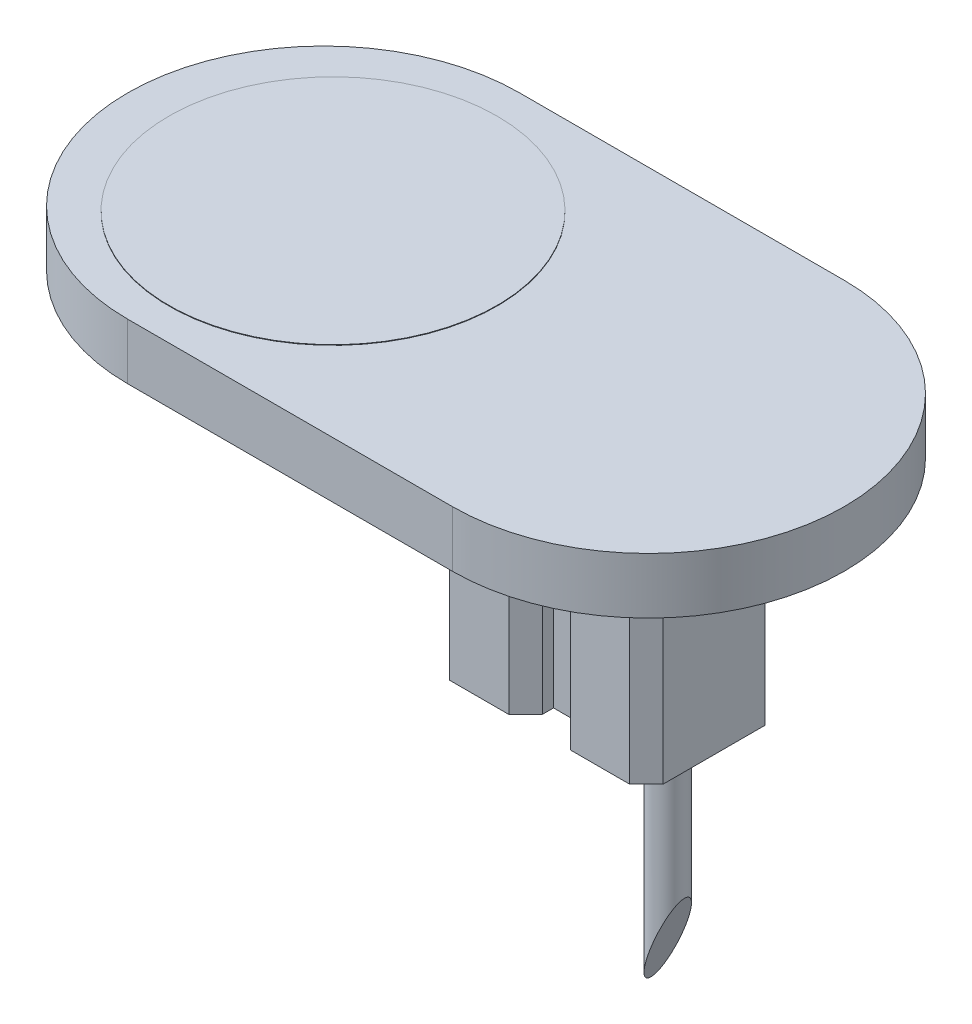
ISO-10303-21;
HEADER;
FILE_DESCRIPTION(('STEP AP214'),'2;1');
FILE_NAME('part.step','',(''),(''),'','','');
FILE_SCHEMA(('AUTOMOTIVE_DESIGN { 1 0 10303 214 1 1 1 1 }'));
ENDSEC;
DATA;
#1=APPLICATION_CONTEXT('core data for automotive mechanical design processes');
#2=APPLICATION_PROTOCOL_DEFINITION('international standard','automotive_design',2000,#1);
#3=PRODUCT_CONTEXT('',#1,'mechanical');
#4=PRODUCT('Part','Part','',(#3));
#5=PRODUCT_RELATED_PRODUCT_CATEGORY('part','',(#4));
#6=PRODUCT_DEFINITION_FORMATION('','',#4);
#7=PRODUCT_DEFINITION_CONTEXT('part definition',#1,'design');
#8=PRODUCT_DEFINITION('design','',#6,#7);
#9=PRODUCT_DEFINITION_SHAPE('','',#8);
#10=(LENGTH_UNIT() NAMED_UNIT(*) SI_UNIT(.MILLI.,.METRE.));
#11=(NAMED_UNIT(*) PLANE_ANGLE_UNIT() SI_UNIT($,.RADIAN.));
#12=(NAMED_UNIT(*) SI_UNIT($,.STERADIAN.) SOLID_ANGLE_UNIT());
#13=UNCERTAINTY_MEASURE_WITH_UNIT(LENGTH_MEASURE(1.E-05),#10,'distance_accuracy_value','');
#14=(GEOMETRIC_REPRESENTATION_CONTEXT(3) GLOBAL_UNCERTAINTY_ASSIGNED_CONTEXT((#13)) GLOBAL_UNIT_ASSIGNED_CONTEXT((#10,
#11,#12)) REPRESENTATION_CONTEXT('',''));
#15=CARTESIAN_POINT('',(0.,0.,0.));
#16=DIRECTION('',(0.,0.,1.));
#17=DIRECTION('',(1.,0.,0.));
#18=AXIS2_PLACEMENT_3D('',#15,#16,#17);
#19=CARTESIAN_POINT('',(-5.65837917886869,-4.,1.21074320255423));
#20=DIRECTION('',(0.,0.,-1.));
#21=DIRECTION('',(-1.,0.,0.));
#22=AXIS2_PLACEMENT_3D('',#19,#20,#21);
#23=PLANE('',#22);
#24=DIRECTION('',(-1.,0.,0.));
#25=VECTOR('',#24,1.);
#26=CARTESIAN_POINT('',(-5.65837917886869,-4.,1.21074320255423));
#27=LINE('',#26,#25);
#28=CARTESIAN_POINT('',(-2.14457884223965,-4.,1.21074320255423));
#29=VERTEX_POINT('',#28);
#30=CARTESIAN_POINT('',(-3.20147901055417,-4.,1.21074320255423));
#31=VERTEX_POINT('',#30);
#32=EDGE_CURVE('E268',#29,#31,#27,.T.);
#33=ORIENTED_EDGE('',*,*,#32,.F.);
#34=DIRECTION('',(0.,1.,0.));
#35=VECTOR('',#34,1.);
#36=CARTESIAN_POINT('',(-2.14457884223965,-4.,1.21074320255423));
#37=LINE('',#36,#35);
#38=CARTESIAN_POINT('',(-2.14457884223965,0.,1.21074320255423));
#39=VERTEX_POINT('',#38);
#40=EDGE_CURVE('E398',#29,#39,#37,.T.);
#41=ORIENTED_EDGE('',*,*,#40,.T.);
#42=DIRECTION('',(-1.,0.,0.));
#43=VECTOR('',#42,1.);
#44=CARTESIAN_POINT('',(-5.65837917886869,0.,1.21074320255423));
#45=LINE('',#44,#43);
#46=CARTESIAN_POINT('',(-3.20147901055417,0.,1.21074320255423));
#47=VERTEX_POINT('',#46);
#48=EDGE_CURVE('E258',#39,#47,#45,.T.);
#49=ORIENTED_EDGE('',*,*,#48,.T.);
#50=DIRECTION('',(0.,-1.,0.));
#51=VECTOR('',#50,1.);
#52=CARTESIAN_POINT('',(-3.20147901055417,-4.,1.21074320255423));
#53=LINE('',#52,#51);
#54=EDGE_CURVE('E395',#47,#31,#53,.T.);
#55=ORIENTED_EDGE('',*,*,#54,.T.);
#56=EDGE_LOOP('',(#33,#41,#49,#55));
#57=FACE_BOUND('',#56,.T.);
#58=ADVANCED_FACE('F40',(#57),#23,.F.);
#59=CARTESIAN_POINT('',(-5.65837917886869,-4.,-1.21074320255423));
#60=DIRECTION('',(0.,0.,1.));
#61=DIRECTION('',(1.,0.,0.));
#62=AXIS2_PLACEMENT_3D('',#59,#60,#61);
#63=PLANE('',#62);
#64=DIRECTION('',(1.,0.,0.));
#65=VECTOR('',#64,1.);
#66=CARTESIAN_POINT('',(-5.65837917886869,-4.,-1.21074320255423));
#67=LINE('',#66,#65);
#68=CARTESIAN_POINT('',(-5.35837917886869,-4.,-1.21074320255423));
#69=VERTEX_POINT('',#68);
#70=CARTESIAN_POINT('',(-4.30147901055417,-4.,-1.21074320255423));
#71=VERTEX_POINT('',#70);
#72=EDGE_CURVE('E259',#69,#71,#67,.T.);
#73=ORIENTED_EDGE('',*,*,#72,.F.);
#74=DIRECTION('',(0.,1.,0.));
#75=VECTOR('',#74,1.);
#76=CARTESIAN_POINT('',(-5.35837917886869,-4.,-1.21074320255423));
#77=LINE('',#76,#75);
#78=CARTESIAN_POINT('',(-5.35837917886869,0.,-1.21074320255423));
#79=VERTEX_POINT('',#78);
#80=EDGE_CURVE('E378',#69,#79,#77,.T.);
#81=ORIENTED_EDGE('',*,*,#80,.T.);
#82=DIRECTION('',(1.,0.,0.));
#83=VECTOR('',#82,1.);
#84=CARTESIAN_POINT('',(-5.65837917886869,0.,-1.21074320255423));
#85=LINE('',#84,#83);
#86=CARTESIAN_POINT('',(-4.30147901055417,0.,-1.21074320255423));
#87=VERTEX_POINT('',#86);
#88=EDGE_CURVE('E277',#79,#87,#85,.T.);
#89=ORIENTED_EDGE('',*,*,#88,.T.);
#90=DIRECTION('',(0.,-1.,0.));
#91=VECTOR('',#90,1.);
#92=CARTESIAN_POINT('',(-4.30147901055417,-4.,-1.21074320255423));
#93=LINE('',#92,#91);
#94=EDGE_CURVE('E375',#87,#71,#93,.T.);
#95=ORIENTED_EDGE('',*,*,#94,.T.);
#96=EDGE_LOOP('',(#73,#81,#89,#95));
#97=FACE_BOUND('',#96,.T.);
#98=ADVANCED_FACE('F480',(#97),#63,.F.);
#99=CARTESIAN_POINT('',(-8.8188622754491,0.,0.));
#100=DIRECTION('',(0.,1.,0.));
#101=DIRECTION('',(0.,0.,1.));
#102=AXIS2_PLACEMENT_3D('',#99,#100,#101);
#103=PLANE('',#102);
#104=CARTESIAN_POINT('',(-8.8188622754491,0.,0.));
#105=DIRECTION('',(0.,1.,0.));
#106=DIRECTION('',(0.,0.,1.));
#107=AXIS2_PLACEMENT_3D('',#104,#105,#106);
#108=CIRCLE('',#107,3.5);
#109=CARTESIAN_POINT('',(-8.8188622754491,0.,-3.5));
#110=VERTEX_POINT('',#109);
#111=CARTESIAN_POINT('',(-8.8188622754491,0.,3.5));
#112=VERTEX_POINT('',#111);
#113=EDGE_CURVE('E292',#110,#112,#108,.T.);
#114=ORIENTED_EDGE('',*,*,#113,.F.);
#115=DIRECTION('',(-1.,0.,0.));
#116=VECTOR('',#115,1.);
#117=CARTESIAN_POINT('',(-8.8188622754491,0.,-3.5));
#118=LINE('',#117,#116);
#119=CARTESIAN_POINT('',(-3.0188622754491,0.,-3.5));
#120=VERTEX_POINT('',#119);
#121=EDGE_CURVE('E304',#120,#110,#118,.T.);
#122=ORIENTED_EDGE('',*,*,#121,.F.);
#123=CARTESIAN_POINT('',(-3.0188622754491,0.,0.));
#124=DIRECTION('',(0.,1.,0.));
#125=DIRECTION('',(0.,0.,1.));
#126=AXIS2_PLACEMENT_3D('',#123,#124,#125);
#127=CIRCLE('',#126,3.5);
#128=CARTESIAN_POINT('',(-3.0188622754491,0.,3.5));
#129=VERTEX_POINT('',#128);
#130=EDGE_CURVE('E320',#129,#120,#127,.T.);
#131=ORIENTED_EDGE('',*,*,#130,.F.);
#132=DIRECTION('',(1.,0.,0.));
#133=VECTOR('',#132,1.);
#134=CARTESIAN_POINT('',(-8.8188622754491,0.,3.5));
#135=LINE('',#134,#133);
#136=EDGE_CURVE('E317',#112,#129,#135,.T.);
#137=ORIENTED_EDGE('',*,*,#136,.F.);
#138=EDGE_LOOP('',(#114,#122,#131,#137));
#139=FACE_BOUND('',#138,.T.);
#140=DIRECTION('',(0.,0.,-1.));
#141=VECTOR('',#140,1.);
#142=CARTESIAN_POINT('',(-5.65837917886869,0.,1.21074320255423));
#143=LINE('',#142,#141);
#144=CARTESIAN_POINT('',(-5.65837917886869,0.,0.91074320255423));
#145=VERTEX_POINT('',#144);
#146=CARTESIAN_POINT('',(-5.65837917886869,0.,-0.91074320255423));
#147=VERTEX_POINT('',#146);
#148=EDGE_CURVE('E252',#145,#147,#143,.T.);
#149=ORIENTED_EDGE('',*,*,#148,.F.);
#150=DIRECTION('',(-0.70710678118655,0.,-0.707106781186545));
#151=VECTOR('',#150,1.);
#152=CARTESIAN_POINT('',(-7.69399232843602,0.,-1.12486994701309));
#153=LINE('',#152,#151);
#154=CARTESIAN_POINT('',(-5.35837917886869,0.,1.21074320255423));
#155=VERTEX_POINT('',#154);
#156=EDGE_CURVE('E414',#145,#155,#153,.F.);
#157=ORIENTED_EDGE('',*,*,#156,.T.);
#158=CARTESIAN_POINT('',(-4.30147901055417,0.,1.21074320255423));
#159=VERTEX_POINT('',#158);
#160=EDGE_CURVE('E285',#159,#155,#45,.T.);
#161=ORIENTED_EDGE('',*,*,#160,.F.);
#162=DIRECTION('',(-0.70710678118655,0.,0.707106781186545));
#163=VECTOR('',#162,1.);
#164=CARTESIAN_POINT('',(-5.95479904172453,0.,2.86406323372458));
#165=LINE('',#164,#163);
#166=CARTESIAN_POINT('',(-4.00147901055417,0.,0.91074320255423));
#167=VERTEX_POINT('',#166);
#168=EDGE_CURVE('E65',#159,#167,#165,.F.);
#169=ORIENTED_EDGE('',*,*,#168,.T.);
#170=DIRECTION('',(0.,0.,1.));
#171=VECTOR('',#170,1.);
#172=CARTESIAN_POINT('',(-4.00147901055417,0.,0.710743202554228));
#173=LINE('',#172,#171);
#174=CARTESIAN_POINT('',(-4.00147901055417,0.,0.710743202554228));
#175=VERTEX_POINT('',#174);
#176=EDGE_CURVE('E201',#175,#167,#173,.T.);
#177=ORIENTED_EDGE('',*,*,#176,.F.);
#178=DIRECTION('',(-1.,0.,0.));
#179=VECTOR('',#178,1.);
#180=CARTESIAN_POINT('',(-3.50147901055417,0.,0.710743202554228));
#181=LINE('',#180,#179);
#182=CARTESIAN_POINT('',(-3.50147901055417,0.,0.710743202554228));
#183=VERTEX_POINT('',#182);
#184=EDGE_CURVE('E205',#183,#175,#181,.T.);
#185=ORIENTED_EDGE('',*,*,#184,.F.);
#186=DIRECTION('',(0.,0.,1.));
#187=VECTOR('',#186,1.);
#188=CARTESIAN_POINT('',(-3.50147901055417,0.,0.710743202554228));
#189=LINE('',#188,#187);
#190=CARTESIAN_POINT('',(-3.50147901055417,0.,0.91074320255423));
#191=VERTEX_POINT('',#190);
#192=EDGE_CURVE('E192',#183,#191,#189,.T.);
#193=ORIENTED_EDGE('',*,*,#192,.T.);
#194=DIRECTION('',(-0.70710678118655,0.,-0.707106781186545));
#195=VECTOR('',#194,1.);
#196=CARTESIAN_POINT('',(-6.61554224427876,0.,-2.20332003117035));
#197=LINE('',#196,#195);
#198=EDGE_CURVE('E45',#191,#47,#197,.F.);
#199=ORIENTED_EDGE('',*,*,#198,.T.);
#200=ORIENTED_EDGE('',*,*,#48,.F.);
#201=DIRECTION('',(-0.707106781186546,0.,0.70710678118655));
#202=VECTOR('',#201,1.);
#203=CARTESIAN_POINT('',(-4.87634895756724,0.,3.94251331788183));
#204=LINE('',#203,#202);
#205=CARTESIAN_POINT('',(-1.84457884223965,0.,0.910743202554226));
#206=VERTEX_POINT('',#205);
#207=EDGE_CURVE('E417',#39,#206,#204,.F.);
#208=ORIENTED_EDGE('',*,*,#207,.T.);
#209=DIRECTION('',(0.,0.,1.));
#210=VECTOR('',#209,1.);
#211=CARTESIAN_POINT('',(-1.84457884223965,0.,1.21074320255423));
#212=LINE('',#211,#210);
#213=CARTESIAN_POINT('',(-1.84457884223965,0.,-0.91074320255423));
#214=VERTEX_POINT('',#213);
#215=EDGE_CURVE('E281',#214,#206,#212,.T.);
#216=ORIENTED_EDGE('',*,*,#215,.F.);
#217=DIRECTION('',(0.70710678118655,0.,0.707106781186545));
#218=VECTOR('',#217,1.);
#219=CARTESIAN_POINT('',(-4.87634895756728,0.,-3.94251331788184));
#220=LINE('',#219,#218);
#221=CARTESIAN_POINT('',(-2.14457884223965,0.,-1.21074320255423));
#222=VERTEX_POINT('',#221);
#223=EDGE_CURVE('E408',#214,#222,#220,.F.);
#224=ORIENTED_EDGE('',*,*,#223,.T.);
#225=CARTESIAN_POINT('',(-3.20147901055417,0.,-1.21074320255423));
#226=VERTEX_POINT('',#225);
#227=EDGE_CURVE('E276',#226,#222,#85,.T.);
#228=ORIENTED_EDGE('',*,*,#227,.F.);
#229=DIRECTION('',(0.707106781186548,0.,-0.707106781186548));
#230=VECTOR('',#229,1.);
#231=CARTESIAN_POINT('',(-6.61554224427875,0.,2.20332003117035));
#232=LINE('',#231,#230);
#233=CARTESIAN_POINT('',(-3.50147901055417,0.,-0.910743202554228));
#234=VERTEX_POINT('',#233);
#235=EDGE_CURVE('E423',#226,#234,#232,.F.);
#236=ORIENTED_EDGE('',*,*,#235,.T.);
#237=DIRECTION('',(1.,0.,0.));
#238=VECTOR('',#237,1.);
#239=CARTESIAN_POINT('',(-4.00147901055417,0.,-0.910743202554228));
#240=LINE('',#239,#238);
#241=CARTESIAN_POINT('',(-4.00147901055417,0.,-0.910743202554228));
#242=VERTEX_POINT('',#241);
#243=EDGE_CURVE('E240',#242,#234,#240,.T.);
#244=ORIENTED_EDGE('',*,*,#243,.F.);
#245=DIRECTION('',(0.707106781186548,0.,0.707106781186548));
#246=VECTOR('',#245,1.);
#247=CARTESIAN_POINT('',(-5.95479904172452,0.,-2.86406323372458));
#248=LINE('',#247,#246);
#249=EDGE_CURVE('E420',#242,#87,#248,.F.);
#250=ORIENTED_EDGE('',*,*,#249,.T.);
#251=ORIENTED_EDGE('',*,*,#88,.F.);
#252=DIRECTION('',(0.707106781186548,0.,-0.707106781186548));
#253=VECTOR('',#252,1.);
#254=CARTESIAN_POINT('',(-7.69399232843601,0.,1.12486994701309));
#255=LINE('',#254,#253);
#256=EDGE_CURVE('E411',#79,#147,#255,.F.);
#257=ORIENTED_EDGE('',*,*,#256,.T.);
#258=EDGE_LOOP('',(#149,#157,#161,#169,#177,#185,#193,#199,#200,#208,#216,#224,#228,#236,#244,
#250,#251,#257));
#259=FACE_BOUND('',#258,.T.);
#260=ADVANCED_FACE('F207',(#139,#259),#103,.F.);
#261=CARTESIAN_POINT('',(-8.8188622754491,1.,0.));
#262=DIRECTION('',(0.,-1.,0.));
#263=DIRECTION('',(0.,0.,-1.));
#264=AXIS2_PLACEMENT_3D('',#261,#262,#263);
#265=CYLINDRICAL_SURFACE('',#264,3.5);
#266=ORIENTED_EDGE('',*,*,#113,.T.);
#267=DIRECTION('',(0.,-1.,0.));
#268=VECTOR('',#267,1.);
#269=CARTESIAN_POINT('',(-8.8188622754491,1.,3.5));
#270=LINE('',#269,#268);
#271=CARTESIAN_POINT('',(-8.8188622754491,1.,3.5));
#272=VERTEX_POINT('',#271);
#273=EDGE_CURVE('E298',#272,#112,#270,.T.);
#274=ORIENTED_EDGE('',*,*,#273,.F.);
#275=CARTESIAN_POINT('',(-8.8188622754491,1.,0.));
#276=DIRECTION('',(0.,1.,0.));
#277=DIRECTION('',(0.,0.,1.));
#278=AXIS2_PLACEMENT_3D('',#275,#276,#277);
#279=CIRCLE('',#278,3.5);
#280=CARTESIAN_POINT('',(-8.8188622754491,1.,-3.5));
#281=VERTEX_POINT('',#280);
#282=EDGE_CURVE('E299',#281,#272,#279,.T.);
#283=ORIENTED_EDGE('',*,*,#282,.F.);
#284=DIRECTION('',(0.,-1.,0.));
#285=VECTOR('',#284,1.);
#286=CARTESIAN_POINT('',(-8.8188622754491,1.,-3.5));
#287=LINE('',#286,#285);
#288=EDGE_CURVE('E313',#281,#110,#287,.T.);
#289=ORIENTED_EDGE('',*,*,#288,.T.);
#290=EDGE_LOOP('',(#266,#274,#283,#289));
#291=FACE_BOUND('',#290,.T.);
#292=ADVANCED_FACE('F647',(#291),#265,.T.);
#293=CARTESIAN_POINT('',(-8.8188622754491,1.,3.5));
#294=DIRECTION('',(0.,0.,-1.));
#295=DIRECTION('',(-1.,0.,0.));
#296=AXIS2_PLACEMENT_3D('',#293,#294,#295);
#297=PLANE('',#296);
#298=ORIENTED_EDGE('',*,*,#136,.T.);
#299=DIRECTION('',(0.,-1.,0.));
#300=VECTOR('',#299,1.);
#301=CARTESIAN_POINT('',(-3.0188622754491,1.,3.5));
#302=LINE('',#301,#300);
#303=CARTESIAN_POINT('',(-3.0188622754491,1.,3.5));
#304=VERTEX_POINT('',#303);
#305=EDGE_CURVE('E332',#304,#129,#302,.T.);
#306=ORIENTED_EDGE('',*,*,#305,.F.);
#307=DIRECTION('',(1.,0.,0.));
#308=VECTOR('',#307,1.);
#309=CARTESIAN_POINT('',(-8.8188622754491,1.,3.5));
#310=LINE('',#309,#308);
#311=EDGE_CURVE('E303',#272,#304,#310,.T.);
#312=ORIENTED_EDGE('',*,*,#311,.F.);
#313=ORIENTED_EDGE('',*,*,#273,.T.);
#314=EDGE_LOOP('',(#298,#306,#312,#313));
#315=FACE_BOUND('',#314,.T.);
#316=ADVANCED_FACE('F713',(#315),#297,.F.);
#317=CARTESIAN_POINT('',(-3.0188622754491,1.,0.));
#318=DIRECTION('',(0.,-1.,0.));
#319=DIRECTION('',(0.,0.,-1.));
#320=AXIS2_PLACEMENT_3D('',#317,#318,#319);
#321=CYLINDRICAL_SURFACE('',#320,3.5);
#322=ORIENTED_EDGE('',*,*,#130,.T.);
#323=DIRECTION('',(0.,-1.,0.));
#324=VECTOR('',#323,1.);
#325=CARTESIAN_POINT('',(-3.0188622754491,1.,-3.5));
#326=LINE('',#325,#324);
#327=CARTESIAN_POINT('',(-3.0188622754491,1.,-3.5));
#328=VERTEX_POINT('',#327);
#329=EDGE_CURVE('E328',#328,#120,#326,.T.);
#330=ORIENTED_EDGE('',*,*,#329,.F.);
#331=CARTESIAN_POINT('',(-3.0188622754491,1.,0.));
#332=DIRECTION('',(0.,1.,0.));
#333=DIRECTION('',(0.,0.,1.));
#334=AXIS2_PLACEMENT_3D('',#331,#332,#333);
#335=CIRCLE('',#334,3.5);
#336=EDGE_CURVE('E307',#304,#328,#335,.T.);
#337=ORIENTED_EDGE('',*,*,#336,.F.);
#338=ORIENTED_EDGE('',*,*,#305,.T.);
#339=EDGE_LOOP('',(#322,#330,#337,#338));
#340=FACE_BOUND('',#339,.T.);
#341=ADVANCED_FACE('F703',(#340),#321,.T.);
#342=CARTESIAN_POINT('',(-8.8188622754491,1.,-3.5));
#343=DIRECTION('',(0.,0.,1.));
#344=DIRECTION('',(1.,0.,0.));
#345=AXIS2_PLACEMENT_3D('',#342,#343,#344);
#346=PLANE('',#345);
#347=ORIENTED_EDGE('',*,*,#121,.T.);
#348=ORIENTED_EDGE('',*,*,#288,.F.);
#349=DIRECTION('',(-1.,0.,0.));
#350=VECTOR('',#349,1.);
#351=CARTESIAN_POINT('',(-8.8188622754491,1.,-3.5));
#352=LINE('',#351,#350);
#353=EDGE_CURVE('E310',#328,#281,#352,.T.);
#354=ORIENTED_EDGE('',*,*,#353,.F.);
#355=ORIENTED_EDGE('',*,*,#329,.T.);
#356=EDGE_LOOP('',(#347,#348,#354,#355));
#357=FACE_BOUND('',#356,.T.);
#358=ADVANCED_FACE('F693',(#357),#346,.F.);
#359=CARTESIAN_POINT('',(-8.8188622754491,1.,0.));
#360=DIRECTION('',(0.,1.,0.));
#361=DIRECTION('',(0.,0.,1.));
#362=AXIS2_PLACEMENT_3D('',#359,#360,#361);
#363=PLANE('',#362);
#364=CARTESIAN_POINT('',(-8.65149971674797,1.,0.));
#365=DIRECTION('',(0.,1.,0.));
#366=DIRECTION('',(0.,0.,1.));
#367=AXIS2_PLACEMENT_3D('',#364,#365,#366);
#368=CIRCLE('',#367,2.93045394720376);
#369=CARTESIAN_POINT('',(-8.65149971674797,1.,-2.93045394720376));
#370=VERTEX_POINT('',#369);
#371=EDGE_CURVE('E293',#370,#370,#368,.T.);
#372=ORIENTED_EDGE('',*,*,#371,.F.);
#373=EDGE_LOOP('',(#372));
#374=FACE_BOUND('',#373,.T.);
#375=ORIENTED_EDGE('',*,*,#282,.T.);
#376=ORIENTED_EDGE('',*,*,#311,.T.);
#377=ORIENTED_EDGE('',*,*,#336,.T.);
#378=ORIENTED_EDGE('',*,*,#353,.T.);
#379=EDGE_LOOP('',(#375,#376,#377,#378));
#380=FACE_BOUND('',#379,.T.);
#381=ADVANCED_FACE('F683',(#374,#380),#363,.T.);
#382=CARTESIAN_POINT('',(-8.65149971674797,1.01,0.));
#383=DIRECTION('',(0.,-1.,0.));
#384=DIRECTION('',(0.,0.,-1.));
#385=AXIS2_PLACEMENT_3D('',#382,#383,#384);
#386=CYLINDRICAL_SURFACE('',#385,2.93045394720376);
#387=CARTESIAN_POINT('',(-8.65149971674797,1.01,0.));
#388=DIRECTION('',(0.,1.,0.));
#389=DIRECTION('',(0.,0.,1.));
#390=AXIS2_PLACEMENT_3D('',#387,#388,#389);
#391=CIRCLE('',#390,2.93045394720376);
#392=CARTESIAN_POINT('',(-8.65149971674797,1.01,-2.93045394720376));
#393=VERTEX_POINT('',#392);
#394=EDGE_CURVE('E272',#393,#393,#391,.T.);
#395=CARTESIAN_POINT('',(-8.65149971674797,1.01,-2.93045394720376));
#396=CARTESIAN_POINT('',(-8.65149971674797,1.00989583333333,-2.93045394720376));
#397=CARTESIAN_POINT('',(-8.65149971674797,1.00979166666667,-2.93045394720376));
#398=CARTESIAN_POINT('',(-8.65149971674797,1.00958333333333,-2.93045394720376));
#399=CARTESIAN_POINT('',(-8.65149971674797,1.00947916666667,-2.93045394720376));
#400=CARTESIAN_POINT('',(-8.65149971674797,1.00927083333333,-2.93045394720376));
#401=CARTESIAN_POINT('',(-8.65149971674797,1.00916666666667,-2.93045394720376));
#402=CARTESIAN_POINT('',(-8.65149971674797,1.00895833333333,-2.93045394720376));
#403=CARTESIAN_POINT('',(-8.65149971674797,1.00885416666667,-2.93045394720376));
#404=CARTESIAN_POINT('',(-8.65149971674797,1.00864583333333,-2.93045394720376));
#405=CARTESIAN_POINT('',(-8.65149971674797,1.00854166666667,-2.93045394720376));
#406=CARTESIAN_POINT('',(-8.65149971674797,1.00833333333333,-2.93045394720376));
#407=CARTESIAN_POINT('',(-8.65149971674797,1.00822916666667,-2.93045394720376));
#408=CARTESIAN_POINT('',(-8.65149971674797,1.00802083333333,-2.93045394720376));
#409=CARTESIAN_POINT('',(-8.65149971674797,1.00791666666667,-2.93045394720376));
#410=CARTESIAN_POINT('',(-8.65149971674797,1.00770833333333,-2.93045394720376));
#411=CARTESIAN_POINT('',(-8.65149971674797,1.00760416666667,-2.93045394720376));
#412=CARTESIAN_POINT('',(-8.65149971674797,1.00739583333333,-2.93045394720376));
#413=CARTESIAN_POINT('',(-8.65149971674797,1.00729166666667,-2.93045394720376));
#414=CARTESIAN_POINT('',(-8.65149971674797,1.00708333333333,-2.93045394720376));
#415=CARTESIAN_POINT('',(-8.65149971674797,1.00697916666667,-2.93045394720376));
#416=CARTESIAN_POINT('',(-8.65149971674797,1.00677083333333,-2.93045394720376));
#417=CARTESIAN_POINT('',(-8.65149971674797,1.00666666666667,-2.93045394720376));
#418=CARTESIAN_POINT('',(-8.65149971674797,1.00645833333333,-2.93045394720376));
#419=CARTESIAN_POINT('',(-8.65149971674797,1.00635416666667,-2.93045394720376));
#420=CARTESIAN_POINT('',(-8.65149971674797,1.00614583333333,-2.93045394720376));
#421=CARTESIAN_POINT('',(-8.65149971674797,1.00604166666667,-2.93045394720376));
#422=CARTESIAN_POINT('',(-8.65149971674797,1.00583333333333,-2.93045394720376));
#423=CARTESIAN_POINT('',(-8.65149971674797,1.00572916666667,-2.93045394720376));
#424=CARTESIAN_POINT('',(-8.65149971674797,1.00552083333333,-2.93045394720376));
#425=CARTESIAN_POINT('',(-8.65149971674797,1.00541666666667,-2.93045394720376));
#426=CARTESIAN_POINT('',(-8.65149971674797,1.00520833333333,-2.93045394720376));
#427=CARTESIAN_POINT('',(-8.65149971674797,1.00510416666667,-2.93045394720376));
#428=CARTESIAN_POINT('',(-8.65149971674797,1.00489583333333,-2.93045394720376));
#429=CARTESIAN_POINT('',(-8.65149971674797,1.00479166666667,-2.93045394720376));
#430=CARTESIAN_POINT('',(-8.65149971674797,1.00458333333333,-2.93045394720376));
#431=CARTESIAN_POINT('',(-8.65149971674797,1.00447916666667,-2.93045394720376));
#432=CARTESIAN_POINT('',(-8.65149971674797,1.00427083333333,-2.93045394720376));
#433=CARTESIAN_POINT('',(-8.65149971674797,1.00416666666667,-2.93045394720376));
#434=CARTESIAN_POINT('',(-8.65149971674797,1.00395833333333,-2.93045394720376));
#435=CARTESIAN_POINT('',(-8.65149971674797,1.00385416666667,-2.93045394720376));
#436=CARTESIAN_POINT('',(-8.65149971674797,1.00364583333333,-2.93045394720376));
#437=CARTESIAN_POINT('',(-8.65149971674797,1.00354166666667,-2.93045394720376));
#438=CARTESIAN_POINT('',(-8.65149971674797,1.00333333333333,-2.93045394720376));
#439=CARTESIAN_POINT('',(-8.65149971674797,1.00322916666667,-2.93045394720376));
#440=CARTESIAN_POINT('',(-8.65149971674797,1.00302083333333,-2.93045394720376));
#441=CARTESIAN_POINT('',(-8.65149971674797,1.00291666666667,-2.93045394720376));
#442=CARTESIAN_POINT('',(-8.65149971674797,1.00270833333333,-2.93045394720376));
#443=CARTESIAN_POINT('',(-8.65149971674797,1.00260416666667,-2.93045394720376));
#444=CARTESIAN_POINT('',(-8.65149971674797,1.00239583333333,-2.93045394720376));
#445=CARTESIAN_POINT('',(-8.65149971674797,1.00229166666667,-2.93045394720376));
#446=CARTESIAN_POINT('',(-8.65149971674797,1.00208333333333,-2.93045394720376));
#447=CARTESIAN_POINT('',(-8.65149971674797,1.00197916666667,-2.93045394720376));
#448=CARTESIAN_POINT('',(-8.65149971674797,1.00177083333333,-2.93045394720376));
#449=CARTESIAN_POINT('',(-8.65149971674797,1.00166666666667,-2.93045394720376));
#450=CARTESIAN_POINT('',(-8.65149971674797,1.00145833333333,-2.93045394720376));
#451=CARTESIAN_POINT('',(-8.65149971674797,1.00135416666667,-2.93045394720376));
#452=CARTESIAN_POINT('',(-8.65149971674797,1.00114583333333,-2.93045394720376));
#453=CARTESIAN_POINT('',(-8.65149971674797,1.00104166666667,-2.93045394720376));
#454=CARTESIAN_POINT('',(-8.65149971674797,1.00083333333333,-2.93045394720376));
#455=CARTESIAN_POINT('',(-8.65149971674797,1.00072916666667,-2.93045394720376));
#456=CARTESIAN_POINT('',(-8.65149971674797,1.00052083333333,-2.93045394720376));
#457=CARTESIAN_POINT('',(-8.65149971674797,1.00041666666667,-2.93045394720376));
#458=CARTESIAN_POINT('',(-8.65149971674797,1.00020833333333,-2.93045394720376));
#459=CARTESIAN_POINT('',(-8.65149971674797,1.00010416666667,-2.93045394720376));
#460=CARTESIAN_POINT('',(-8.65149971674797,1.,-2.93045394720376));
#461=B_SPLINE_CURVE_WITH_KNOTS('',3,(#395,#396,#397,#398,#399,#400,#401,#402,#403,#404,#405,
#406,#407,#408,#409,#410,#411,#412,#413,#414,#415,#416,#417,#418,#419,#420,#421,#422,#423,#424,
#425,#426,#427,#428,#429,#430,#431,#432,#433,#434,#435,#436,#437,#438,#439,#440,#441,#442,#443,
#444,#445,#446,#447,#448,#449,#450,#451,#452,#453,#454,#455,#456,#457,#458,#459,#460),
.UNSPECIFIED.,.F.,.F.,(4,2,2,2,2,2,2,2,2,2,2,2,2,2,2,2,2,2,2,2,2,2,2,2,2,2,2,2,2,2,2,2,4),(0.,
0.000312499999999879,0.000624999999999975,0.000937499999999853,0.00124999999999995,
0.00156249999999983,0.00187499999999992,0.0021874999999998,0.0024999999999999,
0.00281249999999999,0.00312499999999987,0.00343749999999997,0.00374999999999985,
0.00406249999999994,0.00437499999999982,0.00468749999999992,0.00500000000000001,
0.00531249999999989,0.00562499999999999,0.00593749999999987,0.00624999999999996,
0.00656249999999984,0.00687499999999994,0.00718749999999982,0.00749999999999991,
0.00781250000000001,0.00812499999999989,0.00843749999999998,0.00874999999999986,
0.00906249999999996,0.00937499999999983,0.00968749999999993,0.01),.UNSPECIFIED.);
#462=EDGE_CURVE('BSEAM672',#393,#370,#461,.T.);
#463=ORIENTED_EDGE('',*,*,#394,.F.);
#464=ORIENTED_EDGE('',*,*,#371,.T.);
#465=ORIENTED_EDGE('',*,*,#462,.T.);
#466=ORIENTED_EDGE('',*,*,#462,.F.);
#467=EDGE_LOOP('',(#463,#465,#464,#466));
#468=FACE_BOUND('',#467,.T.);
#469=ADVANCED_FACE('F672',(#468),#386,.T.);
#470=CARTESIAN_POINT('',(-8.65149971674797,1.01,0.));
#471=DIRECTION('',(0.,1.,0.));
#472=DIRECTION('',(0.,0.,1.));
#473=AXIS2_PLACEMENT_3D('',#470,#471,#472);
#474=PLANE('',#473);
#475=ORIENTED_EDGE('',*,*,#394,.T.);
#476=EDGE_LOOP('',(#475));
#477=FACE_BOUND('',#476,.T.);
#478=ADVANCED_FACE('F668',(#477),#474,.T.);
#479=CARTESIAN_POINT('',(-5.65837917886869,-4.,1.21074320255423));
#480=DIRECTION('',(1.,0.,0.));
#481=DIRECTION('',(0.,0.,-1.));
#482=AXIS2_PLACEMENT_3D('',#479,#480,#481);
#483=PLANE('',#482);
#484=ORIENTED_EDGE('',*,*,#148,.T.);
#485=DIRECTION('',(0.,-1.,0.));
#486=VECTOR('',#485,1.);
#487=CARTESIAN_POINT('',(-5.65837917886869,-4.,-0.91074320255423));
#488=LINE('',#487,#486);
#489=CARTESIAN_POINT('',(-5.65837917886869,-4.,-0.91074320255423));
#490=VERTEX_POINT('',#489);
#491=EDGE_CURVE('E386',#147,#490,#488,.T.);
#492=ORIENTED_EDGE('',*,*,#491,.T.);
#493=DIRECTION('',(0.,0.,-1.));
#494=VECTOR('',#493,1.);
#495=CARTESIAN_POINT('',(-5.65837917886869,-4.,1.21074320255423));
#496=LINE('',#495,#494);
#497=CARTESIAN_POINT('',(-5.65837917886869,-4.,0.91074320255423));
#498=VERTEX_POINT('',#497);
#499=EDGE_CURVE('E253',#498,#490,#496,.T.);
#500=ORIENTED_EDGE('',*,*,#499,.F.);
#501=DIRECTION('',(0.,1.,0.));
#502=VECTOR('',#501,1.);
#503=CARTESIAN_POINT('',(-5.65837917886869,-4.,0.91074320255423));
#504=LINE('',#503,#502);
#505=EDGE_CURVE('E382',#498,#145,#504,.T.);
#506=ORIENTED_EDGE('',*,*,#505,.T.);
#507=EDGE_LOOP('',(#484,#492,#500,#506));
#508=FACE_BOUND('',#507,.T.);
#509=ADVANCED_FACE('F471',(#508),#483,.F.);
#510=ORIENTED_EDGE('',*,*,#227,.T.);
#511=DIRECTION('',(0.,-1.,0.));
#512=VECTOR('',#511,1.);
#513=CARTESIAN_POINT('',(-2.14457884223965,-4.,-1.21074320255423));
#514=LINE('',#513,#512);
#515=CARTESIAN_POINT('',(-2.14457884223965,-4.,-1.21074320255423));
#516=VERTEX_POINT('',#515);
#517=EDGE_CURVE('E348',#222,#516,#514,.T.);
#518=ORIENTED_EDGE('',*,*,#517,.T.);
#519=CARTESIAN_POINT('',(-3.20147901055417,-4.,-1.21074320255423));
#520=VERTEX_POINT('',#519);
#521=EDGE_CURVE('E257',#520,#516,#67,.T.);
#522=ORIENTED_EDGE('',*,*,#521,.F.);
#523=DIRECTION('',(0.,1.,0.));
#524=VECTOR('',#523,1.);
#525=CARTESIAN_POINT('',(-3.20147901055417,-4.,-1.21074320255423));
#526=LINE('',#525,#524);
#527=EDGE_CURVE('E345',#520,#226,#526,.T.);
#528=ORIENTED_EDGE('',*,*,#527,.T.);
#529=EDGE_LOOP('',(#510,#518,#522,#528));
#530=FACE_BOUND('',#529,.T.);
#531=ADVANCED_FACE('F452',(#530),#63,.F.);
#532=CARTESIAN_POINT('',(-1.84457884223965,-4.,1.21074320255423));
#533=DIRECTION('',(-1.,0.,0.));
#534=DIRECTION('',(0.,0.,1.));
#535=AXIS2_PLACEMENT_3D('',#532,#533,#534);
#536=PLANE('',#535);
#537=DIRECTION('',(0.,0.,1.));
#538=VECTOR('',#537,1.);
#539=CARTESIAN_POINT('',(-1.84457884223965,-4.,1.21074320255423));
#540=LINE('',#539,#538);
#541=CARTESIAN_POINT('',(-1.84457884223965,-4.,-0.91074320255423));
#542=VERTEX_POINT('',#541);
#543=CARTESIAN_POINT('',(-1.84457884223965,-4.,0.910743202554226));
#544=VERTEX_POINT('',#543);
#545=EDGE_CURVE('E263',#542,#544,#540,.T.);
#546=ORIENTED_EDGE('',*,*,#545,.F.);
#547=DIRECTION('',(0.,1.,0.));
#548=VECTOR('',#547,1.);
#549=CARTESIAN_POINT('',(-1.84457884223965,-4.,-0.91074320255423));
#550=LINE('',#549,#548);
#551=EDGE_CURVE('E341',#542,#214,#550,.T.);
#552=ORIENTED_EDGE('',*,*,#551,.T.);
#553=ORIENTED_EDGE('',*,*,#215,.T.);
#554=DIRECTION('',(0.,-1.,0.));
#555=VECTOR('',#554,1.);
#556=CARTESIAN_POINT('',(-1.84457884223965,-4.,0.910743202554226));
#557=LINE('',#556,#555);
#558=EDGE_CURVE('E297',#206,#544,#557,.T.);
#559=ORIENTED_EDGE('',*,*,#558,.T.);
#560=EDGE_LOOP('',(#546,#552,#553,#559));
#561=FACE_BOUND('',#560,.T.);
#562=ADVANCED_FACE('F442',(#561),#536,.F.);
#563=ORIENTED_EDGE('',*,*,#160,.T.);
#564=DIRECTION('',(0.,-1.,0.));
#565=VECTOR('',#564,1.);
#566=CARTESIAN_POINT('',(-5.35837917886869,-4.,1.21074320255423));
#567=LINE('',#566,#565);
#568=CARTESIAN_POINT('',(-5.35837917886869,-4.,1.21074320255423));
#569=VERTEX_POINT('',#568);
#570=EDGE_CURVE('E392',#155,#569,#567,.T.);
#571=ORIENTED_EDGE('',*,*,#570,.T.);
#572=CARTESIAN_POINT('',(-4.30147901055417,-4.,1.21074320255423));
#573=VERTEX_POINT('',#572);
#574=EDGE_CURVE('E267',#573,#569,#27,.T.);
#575=ORIENTED_EDGE('',*,*,#574,.F.);
#576=DIRECTION('',(0.,1.,0.));
#577=VECTOR('',#576,1.);
#578=CARTESIAN_POINT('',(-4.30147901055417,-4.,1.21074320255423));
#579=LINE('',#578,#577);
#580=EDGE_CURVE('E389',#573,#159,#579,.T.);
#581=ORIENTED_EDGE('',*,*,#580,.T.);
#582=EDGE_LOOP('',(#563,#571,#575,#581));
#583=FACE_BOUND('',#582,.T.);
#584=ADVANCED_FACE('F505',(#583),#23,.F.);
#585=CARTESIAN_POINT('',(0.,-4.,0.));
#586=DIRECTION('',(0.,-1.,0.));
#587=DIRECTION('',(0.,0.,-1.));
#588=AXIS2_PLACEMENT_3D('',#585,#586,#587);
#589=PLANE('',#588);
#590=CARTESIAN_POINT('',(-2.67302892639691,-4.,0.));
#591=DIRECTION('',(0.,-1.,0.));
#592=DIRECTION('',(0.,0.,-1.));
#593=AXIS2_PLACEMENT_3D('',#590,#591,#592);
#594=CIRCLE('',#593,0.3);
#595=CARTESIAN_POINT('',(-2.67302892639691,-4.,-0.3));
#596=VERTEX_POINT('',#595);
#597=EDGE_CURVE('E11',#596,#596,#594,.T.);
#598=ORIENTED_EDGE('',*,*,#597,.F.);
#599=EDGE_LOOP('',(#598));
#600=FACE_BOUND('',#599,.T.);
#601=ORIENTED_EDGE('',*,*,#521,.T.);
#602=DIRECTION('',(-0.70710678118655,0.,-0.707106781186545));
#603=VECTOR('',#602,1.);
#604=CARTESIAN_POINT('',(-0.466917819842706,-4.,0.466917819842709));
#605=LINE('',#604,#603);
#606=EDGE_CURVE('E372',#516,#542,#605,.F.);
#607=ORIENTED_EDGE('',*,*,#606,.T.);
#608=ORIENTED_EDGE('',*,*,#545,.T.);
#609=DIRECTION('',(0.707106781186546,0.,-0.70710678118655));
#610=VECTOR('',#609,1.);
#611=CARTESIAN_POINT('',(-0.466917819842719,-4.,-0.466917819842716));
#612=LINE('',#611,#610);
#613=EDGE_CURVE('E363',#544,#29,#612,.F.);
#614=ORIENTED_EDGE('',*,*,#613,.T.);
#615=ORIENTED_EDGE('',*,*,#32,.T.);
#616=DIRECTION('',(0.70710678118655,0.,0.707106781186545));
#617=VECTOR('',#616,1.);
#618=CARTESIAN_POINT('',(-2.20611110655419,-4.,2.2061111065542));
#619=LINE('',#618,#617);
#620=CARTESIAN_POINT('',(-3.50147901055417,-4.,0.91074320255423));
#621=VERTEX_POINT('',#620);
#622=EDGE_CURVE('E351',#31,#621,#619,.F.);
#623=ORIENTED_EDGE('',*,*,#622,.T.);
#624=DIRECTION('',(0.,0.,1.));
#625=VECTOR('',#624,1.);
#626=CARTESIAN_POINT('',(-3.50147901055417,-4.,0.710743202554228));
#627=LINE('',#626,#625);
#628=CARTESIAN_POINT('',(-3.50147901055417,-4.,0.710743202554228));
#629=VERTEX_POINT('',#628);
#630=EDGE_CURVE('E227',#629,#621,#627,.T.);
#631=ORIENTED_EDGE('',*,*,#630,.F.);
#632=DIRECTION('',(1.,0.,0.));
#633=VECTOR('',#632,1.);
#634=CARTESIAN_POINT('',(-3.50147901055417,-4.,0.710743202554228));
#635=LINE('',#634,#633);
#636=CARTESIAN_POINT('',(-4.00147901055417,-4.,0.710743202554228));
#637=VERTEX_POINT('',#636);
#638=EDGE_CURVE('E202',#637,#629,#635,.T.);
#639=ORIENTED_EDGE('',*,*,#638,.F.);
#640=DIRECTION('',(0.,0.,1.));
#641=VECTOR('',#640,1.);
#642=CARTESIAN_POINT('',(-4.00147901055417,-4.,0.710743202554228));
#643=LINE('',#642,#641);
#644=CARTESIAN_POINT('',(-4.00147901055417,-4.,0.91074320255423));
#645=VERTEX_POINT('',#644);
#646=EDGE_CURVE('E231',#637,#645,#643,.T.);
#647=ORIENTED_EDGE('',*,*,#646,.T.);
#648=DIRECTION('',(0.70710678118655,0.,-0.707106781186545));
#649=VECTOR('',#648,1.);
#650=CARTESIAN_POINT('',(-1.54536790399996,-4.,-1.54536790399997));
#651=LINE('',#650,#649);
#652=EDGE_CURVE('E354',#645,#573,#651,.F.);
#653=ORIENTED_EDGE('',*,*,#652,.T.);
#654=ORIENTED_EDGE('',*,*,#574,.T.);
#655=DIRECTION('',(0.70710678118655,0.,0.707106781186545));
#656=VECTOR('',#655,1.);
#657=CARTESIAN_POINT('',(-3.28456119071144,-4.,3.28456119071146));
#658=LINE('',#657,#656);
#659=EDGE_CURVE('E366',#569,#498,#658,.F.);
#660=ORIENTED_EDGE('',*,*,#659,.T.);
#661=ORIENTED_EDGE('',*,*,#499,.T.);
#662=DIRECTION('',(-0.707106781186548,0.,0.707106781186548));
#663=VECTOR('',#662,1.);
#664=CARTESIAN_POINT('',(-3.28456119071146,-4.,-3.28456119071146));
#665=LINE('',#664,#663);
#666=EDGE_CURVE('E369',#490,#69,#665,.F.);
#667=ORIENTED_EDGE('',*,*,#666,.T.);
#668=ORIENTED_EDGE('',*,*,#72,.T.);
#669=DIRECTION('',(-0.707106781186548,0.,-0.707106781186548));
#670=VECTOR('',#669,1.);
#671=CARTESIAN_POINT('',(-1.54536790399997,-4.,1.54536790399997));
#672=LINE('',#671,#670);
#673=CARTESIAN_POINT('',(-4.00147901055417,-4.,-0.910743202554228));
#674=VERTEX_POINT('',#673);
#675=EDGE_CURVE('E360',#71,#674,#672,.F.);
#676=ORIENTED_EDGE('',*,*,#675,.T.);
#677=DIRECTION('',(-1.,0.,0.));
#678=VECTOR('',#677,1.);
#679=CARTESIAN_POINT('',(-4.00147901055417,-4.,-0.910743202554228));
#680=LINE('',#679,#678);
#681=CARTESIAN_POINT('',(-3.50147901055417,-4.,-0.910743202554228));
#682=VERTEX_POINT('',#681);
#683=EDGE_CURVE('E248',#682,#674,#680,.T.);
#684=ORIENTED_EDGE('',*,*,#683,.F.);
#685=DIRECTION('',(-0.707106781186548,0.,0.707106781186548));
#686=VECTOR('',#685,1.);
#687=CARTESIAN_POINT('',(-2.2061111065542,-4.,-2.2061111065542));
#688=LINE('',#687,#686);
#689=EDGE_CURVE('E357',#682,#520,#688,.F.);
#690=ORIENTED_EDGE('',*,*,#689,.T.);
#691=EDGE_LOOP('',(#601,#607,#608,#614,#615,#623,#631,#639,#647,#653,#654,#660,#661,#667,#668,
#676,#684,#690));
#692=FACE_BOUND('',#691,.T.);
#693=ADVANCED_FACE('F434',(#600,#692),#589,.T.);
#694=CARTESIAN_POINT('',(0.,0.,-0.910743202554228));
#695=DIRECTION('',(0.,0.,-1.));
#696=DIRECTION('',(-1.,0.,0.));
#697=AXIS2_PLACEMENT_3D('',#694,#695,#696);
#698=PLANE('',#697);
#699=DIRECTION('',(0.,1.,0.));
#700=VECTOR('',#699,1.);
#701=CARTESIAN_POINT('',(-4.00147901055417,-4.,-0.910743202554228));
#702=LINE('',#701,#700);
#703=EDGE_CURVE('E230',#674,#242,#702,.T.);
#704=ORIENTED_EDGE('',*,*,#703,.T.);
#705=ORIENTED_EDGE('',*,*,#243,.T.);
#706=DIRECTION('',(0.,-1.,0.));
#707=VECTOR('',#706,1.);
#708=CARTESIAN_POINT('',(-3.50147901055417,-4.,-0.910743202554228));
#709=LINE('',#708,#707);
#710=EDGE_CURVE('E244',#234,#682,#709,.T.);
#711=ORIENTED_EDGE('',*,*,#710,.T.);
#712=ORIENTED_EDGE('',*,*,#683,.T.);
#713=EDGE_LOOP('',(#704,#705,#711,#712));
#714=FACE_BOUND('',#713,.T.);
#715=ADVANCED_FACE('F489',(#714),#698,.T.);
#716=CARTESIAN_POINT('',(-3.50147901055417,-4.,0.710743202554228));
#717=DIRECTION('',(1.,0.,0.));
#718=DIRECTION('',(0.,0.,-1.));
#719=AXIS2_PLACEMENT_3D('',#716,#717,#718);
#720=PLANE('',#719);
#721=ORIENTED_EDGE('',*,*,#630,.T.);
#722=DIRECTION('',(0.,1.,0.));
#723=VECTOR('',#722,1.);
#724=CARTESIAN_POINT('',(-3.50147901055417,-4.,0.91074320255423));
#725=LINE('',#724,#723);
#726=EDGE_CURVE('E199',#621,#191,#725,.T.);
#727=ORIENTED_EDGE('',*,*,#726,.T.);
#728=ORIENTED_EDGE('',*,*,#192,.F.);
#729=DIRECTION('',(0.,1.,0.));
#730=VECTOR('',#729,1.);
#731=CARTESIAN_POINT('',(-3.50147901055417,-4.,0.710743202554228));
#732=LINE('',#731,#730);
#733=EDGE_CURVE('E197',#629,#183,#732,.T.);
#734=ORIENTED_EDGE('',*,*,#733,.F.);
#735=EDGE_LOOP('',(#721,#727,#728,#734));
#736=FACE_BOUND('',#735,.T.);
#737=ADVANCED_FACE('F195',(#736),#720,.F.);
#738=CARTESIAN_POINT('',(-4.00147901055417,-4.,0.710743202554228));
#739=DIRECTION('',(-1.,0.,0.));
#740=DIRECTION('',(0.,0.,1.));
#741=AXIS2_PLACEMENT_3D('',#738,#739,#740);
#742=PLANE('',#741);
#743=ORIENTED_EDGE('',*,*,#176,.T.);
#744=DIRECTION('',(0.,-1.,0.));
#745=VECTOR('',#744,1.);
#746=CARTESIAN_POINT('',(-4.00147901055417,-4.,0.91074320255423));
#747=LINE('',#746,#745);
#748=EDGE_CURVE('E402',#167,#645,#747,.T.);
#749=ORIENTED_EDGE('',*,*,#748,.T.);
#750=ORIENTED_EDGE('',*,*,#646,.F.);
#751=DIRECTION('',(0.,-1.,0.));
#752=VECTOR('',#751,1.);
#753=CARTESIAN_POINT('',(-4.00147901055417,-4.,0.710743202554228));
#754=LINE('',#753,#752);
#755=EDGE_CURVE('E211',#175,#637,#754,.T.);
#756=ORIENTED_EDGE('',*,*,#755,.F.);
#757=EDGE_LOOP('',(#743,#749,#750,#756));
#758=FACE_BOUND('',#757,.T.);
#759=ADVANCED_FACE('F521',(#758),#742,.F.);
#760=CARTESIAN_POINT('',(0.,0.,0.710743202554228));
#761=DIRECTION('',(0.,0.,1.));
#762=DIRECTION('',(1.,0.,0.));
#763=AXIS2_PLACEMENT_3D('',#760,#761,#762);
#764=PLANE('',#763);
#765=ORIENTED_EDGE('',*,*,#733,.T.);
#766=ORIENTED_EDGE('',*,*,#184,.T.);
#767=ORIENTED_EDGE('',*,*,#755,.T.);
#768=ORIENTED_EDGE('',*,*,#638,.T.);
#769=EDGE_LOOP('',(#765,#766,#767,#768));
#770=FACE_BOUND('',#769,.T.);
#771=ADVANCED_FACE('F213',(#770),#764,.T.);
#772=CARTESIAN_POINT('',(-1.84457884223965,-4.,-0.91074320255423));
#773=DIRECTION('',(-0.707106781186545,0.,0.70710678118655));
#774=DIRECTION('',(0.,1.,0.));
#775=AXIS2_PLACEMENT_3D('',#772,#773,#774);
#776=PLANE('',#775);
#777=ORIENTED_EDGE('',*,*,#606,.F.);
#778=ORIENTED_EDGE('',*,*,#517,.F.);
#779=ORIENTED_EDGE('',*,*,#223,.F.);
#780=ORIENTED_EDGE('',*,*,#551,.F.);
#781=EDGE_LOOP('',(#777,#778,#779,#780));
#782=FACE_BOUND('',#781,.T.);
#783=ADVANCED_FACE('F446',(#782),#776,.F.);
#784=CARTESIAN_POINT('',(-5.35837917886869,-4.,-1.21074320255423));
#785=DIRECTION('',(0.707106781186547,0.,0.707106781186547));
#786=DIRECTION('',(0.,1.,0.));
#787=AXIS2_PLACEMENT_3D('',#784,#785,#786);
#788=PLANE('',#787);
#789=ORIENTED_EDGE('',*,*,#666,.F.);
#790=ORIENTED_EDGE('',*,*,#491,.F.);
#791=ORIENTED_EDGE('',*,*,#256,.F.);
#792=ORIENTED_EDGE('',*,*,#80,.F.);
#793=EDGE_LOOP('',(#789,#790,#791,#792));
#794=FACE_BOUND('',#793,.T.);
#795=ADVANCED_FACE('F477',(#794),#788,.F.);
#796=CARTESIAN_POINT('',(-5.65837917886869,-4.,0.91074320255423));
#797=DIRECTION('',(0.707106781186545,0.,-0.70710678118655));
#798=DIRECTION('',(0.,1.,0.));
#799=AXIS2_PLACEMENT_3D('',#796,#797,#798);
#800=PLANE('',#799);
#801=ORIENTED_EDGE('',*,*,#659,.F.);
#802=ORIENTED_EDGE('',*,*,#570,.F.);
#803=ORIENTED_EDGE('',*,*,#156,.F.);
#804=ORIENTED_EDGE('',*,*,#505,.F.);
#805=EDGE_LOOP('',(#801,#802,#803,#804));
#806=FACE_BOUND('',#805,.T.);
#807=ADVANCED_FACE('F469',(#806),#800,.F.);
#808=CARTESIAN_POINT('',(-2.14457884223965,-4.,1.21074320255423));
#809=DIRECTION('',(-0.70710678118655,0.,-0.707106781186546));
#810=DIRECTION('',(0.,1.,0.));
#811=AXIS2_PLACEMENT_3D('',#808,#809,#810);
#812=PLANE('',#811);
#813=ORIENTED_EDGE('',*,*,#613,.F.);
#814=ORIENTED_EDGE('',*,*,#558,.F.);
#815=ORIENTED_EDGE('',*,*,#207,.F.);
#816=ORIENTED_EDGE('',*,*,#40,.F.);
#817=EDGE_LOOP('',(#813,#814,#815,#816));
#818=FACE_BOUND('',#817,.T.);
#819=ADVANCED_FACE('F437',(#818),#812,.F.);
#820=CARTESIAN_POINT('',(-4.00147901055417,-4.,-0.910743202554228));
#821=DIRECTION('',(-0.707106781186547,0.,0.707106781186547));
#822=DIRECTION('',(0.,1.,0.));
#823=AXIS2_PLACEMENT_3D('',#820,#821,#822);
#824=PLANE('',#823);
#825=ORIENTED_EDGE('',*,*,#675,.F.);
#826=ORIENTED_EDGE('',*,*,#94,.F.);
#827=ORIENTED_EDGE('',*,*,#249,.F.);
#828=ORIENTED_EDGE('',*,*,#703,.F.);
#829=EDGE_LOOP('',(#825,#826,#827,#828));
#830=FACE_BOUND('',#829,.T.);
#831=ADVANCED_FACE('F486',(#830),#824,.F.);
#832=CARTESIAN_POINT('',(-3.50147901055417,-4.,-0.910743202554228));
#833=DIRECTION('',(0.707106781186547,0.,0.707106781186547));
#834=DIRECTION('',(0.,-1.,0.));
#835=AXIS2_PLACEMENT_3D('',#832,#833,#834);
#836=PLANE('',#835);
#837=ORIENTED_EDGE('',*,*,#235,.F.);
#838=ORIENTED_EDGE('',*,*,#527,.F.);
#839=ORIENTED_EDGE('',*,*,#689,.F.);
#840=ORIENTED_EDGE('',*,*,#710,.F.);
#841=EDGE_LOOP('',(#837,#838,#839,#840));
#842=FACE_BOUND('',#841,.T.);
#843=ADVANCED_FACE('F492',(#842),#836,.F.);
#844=CARTESIAN_POINT('',(-4.00147901055417,-4.,0.91074320255423));
#845=DIRECTION('',(-0.707106781186545,0.,-0.70710678118655));
#846=DIRECTION('',(0.,-1.,0.));
#847=AXIS2_PLACEMENT_3D('',#844,#845,#846);
#848=PLANE('',#847);
#849=ORIENTED_EDGE('',*,*,#168,.F.);
#850=ORIENTED_EDGE('',*,*,#580,.F.);
#851=ORIENTED_EDGE('',*,*,#652,.F.);
#852=ORIENTED_EDGE('',*,*,#748,.F.);
#853=EDGE_LOOP('',(#849,#850,#851,#852));
#854=FACE_BOUND('',#853,.T.);
#855=ADVANCED_FACE('F494',(#854),#848,.F.);
#856=CARTESIAN_POINT('',(-3.50147901055417,-4.,0.91074320255423));
#857=DIRECTION('',(0.707106781186545,0.,-0.70710678118655));
#858=DIRECTION('',(0.,1.,0.));
#859=AXIS2_PLACEMENT_3D('',#856,#857,#858);
#860=PLANE('',#859);
#861=ORIENTED_EDGE('',*,*,#622,.F.);
#862=ORIENTED_EDGE('',*,*,#54,.F.);
#863=ORIENTED_EDGE('',*,*,#198,.F.);
#864=ORIENTED_EDGE('',*,*,#726,.F.);
#865=EDGE_LOOP('',(#861,#862,#863,#864));
#866=FACE_BOUND('',#865,.T.);
#867=ADVANCED_FACE('F43',(#866),#860,.F.);
#868=CARTESIAN_POINT('',(-2.67302892639691,-8.,0.));
#869=DIRECTION('',(0.,1.,0.));
#870=DIRECTION('',(0.,0.,1.));
#871=AXIS2_PLACEMENT_3D('',#868,#869,#870);
#872=CYLINDRICAL_SURFACE('',#871,0.3);
#873=CARTESIAN_POINT('',(-2.67302892639691,-7.24258442086816,0.));
#874=DIRECTION('',(-0.929726918566118,0.368249720832958,0.));
#875=DIRECTION('',(0.368249720832958,0.929726918566118,0.));
#876=AXIS2_PLACEMENT_3D('',#873,#874,#875);
#877=ELLIPSE('',#876,0.81466456871011,0.3);
#878=CARTESIAN_POINT('',(-2.37302892639691,-6.48516884173631,0.));
#879=VERTEX_POINT('',#878);
#880=EDGE_CURVE('E217',#879,#879,#877,.T.);
#881=ORIENTED_EDGE('',*,*,#880,.T.);
#882=EDGE_LOOP('',(#881));
#883=FACE_BOUND('',#882,.T.);
#884=ORIENTED_EDGE('',*,*,#597,.T.);
#885=EDGE_LOOP('',(#884));
#886=FACE_BOUND('',#885,.T.);
#887=ADVANCED_FACE('F603',(#883,#886),#872,.T.);
#888=CARTESIAN_POINT('',(-2.97302892639691,-8.,-2.));
#889=DIRECTION('',(-0.929726918566118,0.368249720832958,0.));
#890=DIRECTION('',(-0.368249720832958,-0.929726918566118,0.));
#891=AXIS2_PLACEMENT_3D('',#888,#889,#890);
#892=PLANE('',#891);
#893=ORIENTED_EDGE('',*,*,#880,.F.);
#894=EDGE_LOOP('',(#893));
#895=FACE_BOUND('',#894,.T.);
#896=ADVANCED_FACE('F618',(#895),#892,.F.);
#897=CLOSED_SHELL('',(#58,#98,#260,#292,#316,#341,#358,#381,#469,#478,#509,#531,#562,#584,#693,
#715,#737,#759,#771,#783,#795,#807,#819,#831,#843,#855,#867,#887,#896));
#898=MANIFOLD_SOLID_BREP('B2',#897);
#899=ADVANCED_BREP_SHAPE_REPRESENTATION('',(#18,#898),#14);
#900=SHAPE_DEFINITION_REPRESENTATION(#9,#899);
ENDSEC;
END-ISO-10303-21;
